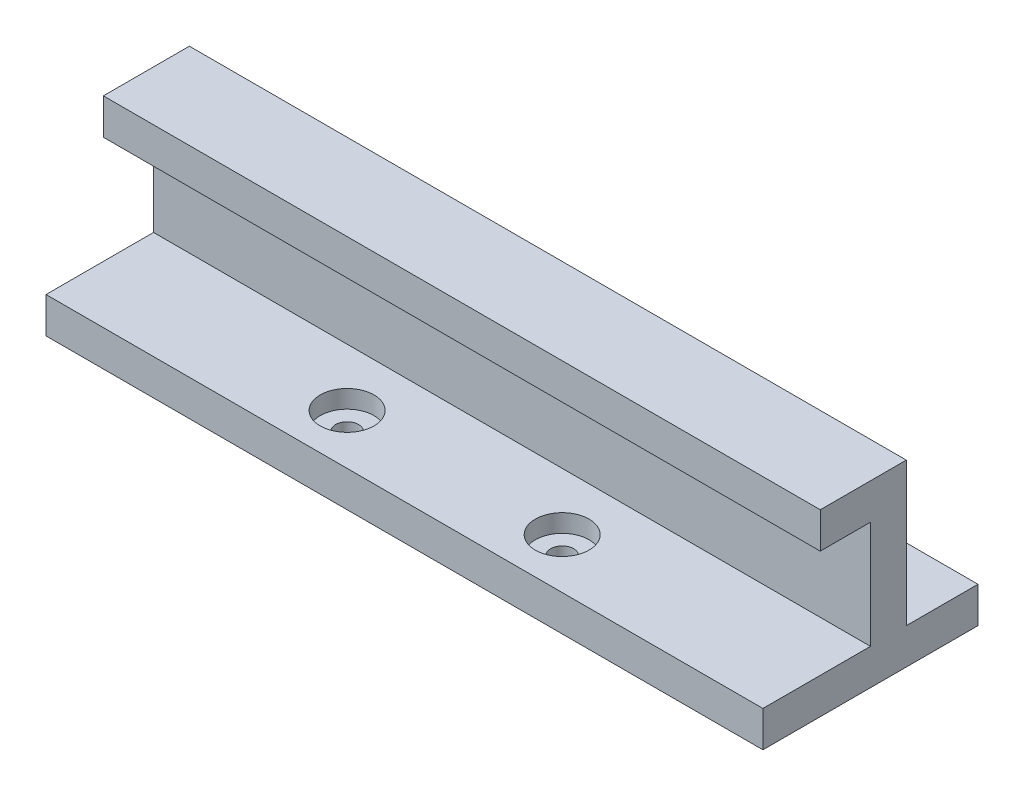
ISO-10303-21;
HEADER;
FILE_DESCRIPTION(('STEP AP214'),'2;1');
FILE_NAME('part.step','',(''),(''),'','','');
FILE_SCHEMA(('AUTOMOTIVE_DESIGN { 1 0 10303 214 1 1 1 1 }'));
ENDSEC;
DATA;
#1=APPLICATION_CONTEXT('core data for automotive mechanical design processes');
#2=APPLICATION_PROTOCOL_DEFINITION('international standard','automotive_design',2000,#1);
#3=PRODUCT_CONTEXT('',#1,'mechanical');
#4=PRODUCT('Part','Part','',(#3));
#5=PRODUCT_RELATED_PRODUCT_CATEGORY('part','',(#4));
#6=PRODUCT_DEFINITION_FORMATION('','',#4);
#7=PRODUCT_DEFINITION_CONTEXT('part definition',#1,'design');
#8=PRODUCT_DEFINITION('design','',#6,#7);
#9=PRODUCT_DEFINITION_SHAPE('','',#8);
#10=(LENGTH_UNIT() NAMED_UNIT(*) SI_UNIT(.MILLI.,.METRE.));
#11=(NAMED_UNIT(*) PLANE_ANGLE_UNIT() SI_UNIT($,.RADIAN.));
#12=(NAMED_UNIT(*) SI_UNIT($,.STERADIAN.) SOLID_ANGLE_UNIT());
#13=UNCERTAINTY_MEASURE_WITH_UNIT(LENGTH_MEASURE(1.E-05),#10,'distance_accuracy_value','');
#14=(GEOMETRIC_REPRESENTATION_CONTEXT(3) GLOBAL_UNCERTAINTY_ASSIGNED_CONTEXT((#13)) GLOBAL_UNIT_ASSIGNED_CONTEXT((#10,
#11,#12)) REPRESENTATION_CONTEXT('',''));
#15=CARTESIAN_POINT('',(0.,0.,0.));
#16=DIRECTION('',(0.,0.,1.));
#17=DIRECTION('',(1.,0.,0.));
#18=AXIS2_PLACEMENT_3D('',#15,#16,#17);
#19=CARTESIAN_POINT('',(35.,5.,-7.));
#20=DIRECTION('',(0.,-1.,0.));
#21=DIRECTION('',(0.,0.,-1.));
#22=AXIS2_PLACEMENT_3D('',#19,#20,#21);
#23=CYLINDRICAL_SURFACE('',#22,1.6);
#24=CARTESIAN_POINT('',(35.,0.,-7.));
#25=DIRECTION('',(0.,1.,0.));
#26=DIRECTION('',(0.,0.,1.));
#27=AXIS2_PLACEMENT_3D('',#24,#25,#26);
#28=CIRCLE('',#27,1.6);
#29=CARTESIAN_POINT('',(35.,0.,-5.4));
#30=VERTEX_POINT('',#29);
#31=EDGE_CURVE('E179',#30,#30,#28,.T.);
#32=ORIENTED_EDGE('',*,*,#31,.F.);
#33=EDGE_LOOP('',(#32));
#34=FACE_BOUND('',#33,.T.);
#35=CARTESIAN_POINT('',(35.,2.5,-7.));
#36=DIRECTION('',(0.,1.,0.));
#37=DIRECTION('',(0.,0.,1.));
#38=AXIS2_PLACEMENT_3D('',#35,#36,#37);
#39=CIRCLE('',#38,1.6);
#40=CARTESIAN_POINT('',(35.,2.5,-5.4));
#41=VERTEX_POINT('',#40);
#42=EDGE_CURVE('E37',#41,#41,#39,.T.);
#43=ORIENTED_EDGE('',*,*,#42,.T.);
#44=EDGE_LOOP('',(#43));
#45=FACE_BOUND('',#44,.T.);
#46=ADVANCED_FACE('F33',(#34,#45),#23,.F.);
#47=CARTESIAN_POINT('',(65.,5.,-7.));
#48=DIRECTION('',(0.,-1.,0.));
#49=DIRECTION('',(0.,0.,-1.));
#50=AXIS2_PLACEMENT_3D('',#47,#48,#49);
#51=CYLINDRICAL_SURFACE('',#50,1.60000000000001);
#52=CARTESIAN_POINT('',(65.,0.,-7.));
#53=DIRECTION('',(0.,1.,0.));
#54=DIRECTION('',(0.,0.,1.));
#55=AXIS2_PLACEMENT_3D('',#52,#53,#54);
#56=CIRCLE('',#55,1.60000000000001);
#57=CARTESIAN_POINT('',(65.,0.,-5.39999999999999));
#58=VERTEX_POINT('',#57);
#59=EDGE_CURVE('E176',#58,#58,#56,.T.);
#60=ORIENTED_EDGE('',*,*,#59,.F.);
#61=EDGE_LOOP('',(#60));
#62=FACE_BOUND('',#61,.T.);
#63=CARTESIAN_POINT('',(65.,2.5,-7.));
#64=DIRECTION('',(0.,1.,0.));
#65=DIRECTION('',(0.,0.,1.));
#66=AXIS2_PLACEMENT_3D('',#63,#64,#65);
#67=CIRCLE('',#66,1.60000000000001);
#68=CARTESIAN_POINT('',(65.,2.5,-5.39999999999999));
#69=VERTEX_POINT('',#68);
#70=EDGE_CURVE('E205',#69,#69,#67,.T.);
#71=ORIENTED_EDGE('',*,*,#70,.T.);
#72=EDGE_LOOP('',(#71));
#73=FACE_BOUND('',#72,.T.);
#74=ADVANCED_FACE('F269',(#62,#73),#51,.F.);
#75=CARTESIAN_POINT('',(70.,5.,-25.));
#76=DIRECTION('',(0.,-1.,0.));
#77=DIRECTION('',(0.,0.,-1.));
#78=AXIS2_PLACEMENT_3D('',#75,#76,#77);
#79=CYLINDRICAL_SURFACE('',#78,1.6);
#80=CARTESIAN_POINT('',(70.,0.,-25.));
#81=DIRECTION('',(0.,1.,0.));
#82=DIRECTION('',(0.,0.,1.));
#83=AXIS2_PLACEMENT_3D('',#80,#81,#82);
#84=CIRCLE('',#83,1.6);
#85=CARTESIAN_POINT('',(70.,0.,-23.4));
#86=VERTEX_POINT('',#85);
#87=EDGE_CURVE('E137',#86,#86,#84,.T.);
#88=ORIENTED_EDGE('',*,*,#87,.F.);
#89=EDGE_LOOP('',(#88));
#90=FACE_BOUND('',#89,.T.);
#91=CARTESIAN_POINT('',(70.,2.5,-25.));
#92=DIRECTION('',(0.,1.,0.));
#93=DIRECTION('',(0.,0.,1.));
#94=AXIS2_PLACEMENT_3D('',#91,#92,#93);
#95=CIRCLE('',#94,1.6);
#96=CARTESIAN_POINT('',(70.,2.5,-23.4));
#97=VERTEX_POINT('',#96);
#98=EDGE_CURVE('E202',#97,#97,#95,.T.);
#99=ORIENTED_EDGE('',*,*,#98,.T.);
#100=EDGE_LOOP('',(#99));
#101=FACE_BOUND('',#100,.T.);
#102=ADVANCED_FACE('F275',(#90,#101),#79,.F.);
#103=CARTESIAN_POINT('',(30.,5.,-25.));
#104=DIRECTION('',(0.,-1.,0.));
#105=DIRECTION('',(0.,0.,-1.));
#106=AXIS2_PLACEMENT_3D('',#103,#104,#105);
#107=CYLINDRICAL_SURFACE('',#106,1.6);
#108=CARTESIAN_POINT('',(30.,0.,-25.));
#109=DIRECTION('',(0.,1.,0.));
#110=DIRECTION('',(0.,0.,1.));
#111=AXIS2_PLACEMENT_3D('',#108,#109,#110);
#112=CIRCLE('',#111,1.6);
#113=CARTESIAN_POINT('',(30.,0.,-23.4));
#114=VERTEX_POINT('',#113);
#115=EDGE_CURVE('E210',#114,#114,#112,.T.);
#116=ORIENTED_EDGE('',*,*,#115,.F.);
#117=EDGE_LOOP('',(#116));
#118=FACE_BOUND('',#117,.T.);
#119=CARTESIAN_POINT('',(30.,2.5,-25.));
#120=DIRECTION('',(0.,1.,0.));
#121=DIRECTION('',(0.,0.,1.));
#122=AXIS2_PLACEMENT_3D('',#119,#120,#121);
#123=CIRCLE('',#122,1.6);
#124=CARTESIAN_POINT('',(30.,2.5,-23.4));
#125=VERTEX_POINT('',#124);
#126=EDGE_CURVE('E199',#125,#125,#123,.T.);
#127=ORIENTED_EDGE('',*,*,#126,.T.);
#128=EDGE_LOOP('',(#127));
#129=FACE_BOUND('',#128,.T.);
#130=ADVANCED_FACE('F292',(#118,#129),#107,.F.);
#131=CARTESIAN_POINT('',(0.,5.,-20.));
#132=DIRECTION('',(0.,0.,1.));
#133=DIRECTION('',(1.,0.,0.));
#134=AXIS2_PLACEMENT_3D('',#131,#132,#133);
#135=PLANE('',#134);
#136=DIRECTION('',(1.,0.,0.));
#137=VECTOR('',#136,1.);
#138=CARTESIAN_POINT('',(0.,5.,-20.));
#139=LINE('',#138,#137);
#140=CARTESIAN_POINT('',(0.,5.,-20.));
#141=VERTEX_POINT('',#140);
#142=CARTESIAN_POINT('',(100.,5.,-20.));
#143=VERTEX_POINT('',#142);
#144=EDGE_CURVE('E50',#141,#143,#139,.T.);
#145=ORIENTED_EDGE('',*,*,#144,.F.);
#146=DIRECTION('',(0.,-1.,0.));
#147=VECTOR('',#146,1.);
#148=CARTESIAN_POINT('',(0.,5.,-20.));
#149=LINE('',#148,#147);
#150=CARTESIAN_POINT('',(0.,25.,-20.));
#151=VERTEX_POINT('',#150);
#152=EDGE_CURVE('E119',#151,#141,#149,.T.);
#153=ORIENTED_EDGE('',*,*,#152,.F.);
#154=DIRECTION('',(-1.,0.,0.));
#155=VECTOR('',#154,1.);
#156=CARTESIAN_POINT('',(0.,25.,-20.));
#157=LINE('',#156,#155);
#158=CARTESIAN_POINT('',(100.,25.,-20.));
#159=VERTEX_POINT('',#158);
#160=EDGE_CURVE('E116',#159,#151,#157,.T.);
#161=ORIENTED_EDGE('',*,*,#160,.F.);
#162=DIRECTION('',(0.,-1.,0.));
#163=VECTOR('',#162,1.);
#164=CARTESIAN_POINT('',(100.,5.,-20.));
#165=LINE('',#164,#163);
#166=EDGE_CURVE('E112',#159,#143,#165,.T.);
#167=ORIENTED_EDGE('',*,*,#166,.T.);
#168=EDGE_LOOP('',(#145,#153,#161,#167));
#169=FACE_BOUND('',#168,.T.);
#170=ADVANCED_FACE('F114',(#169),#135,.F.);
#171=CARTESIAN_POINT('',(0.,25.,-15.));
#172=DIRECTION('',(0.,0.,-1.));
#173=DIRECTION('',(-1.,0.,0.));
#174=AXIS2_PLACEMENT_3D('',#171,#172,#173);
#175=PLANE('',#174);
#176=DIRECTION('',(1.,0.,0.));
#177=VECTOR('',#176,1.);
#178=CARTESIAN_POINT('',(0.,20.,-15.));
#179=LINE('',#178,#177);
#180=CARTESIAN_POINT('',(0.,20.,-15.));
#181=VERTEX_POINT('',#180);
#182=CARTESIAN_POINT('',(100.,20.,-15.));
#183=VERTEX_POINT('',#182);
#184=EDGE_CURVE('E148',#181,#183,#179,.T.);
#185=ORIENTED_EDGE('',*,*,#184,.F.);
#186=DIRECTION('',(0.,-1.,0.));
#187=VECTOR('',#186,1.);
#188=CARTESIAN_POINT('',(0.,25.,-15.));
#189=LINE('',#188,#187);
#190=CARTESIAN_POINT('',(0.,5.,-15.));
#191=VERTEX_POINT('',#190);
#192=EDGE_CURVE('E58',#181,#191,#189,.T.);
#193=ORIENTED_EDGE('',*,*,#192,.T.);
#194=DIRECTION('',(1.,0.,0.));
#195=VECTOR('',#194,1.);
#196=CARTESIAN_POINT('',(0.,5.,-15.));
#197=LINE('',#196,#195);
#198=CARTESIAN_POINT('',(100.,5.,-15.));
#199=VERTEX_POINT('',#198);
#200=EDGE_CURVE('E166',#191,#199,#197,.T.);
#201=ORIENTED_EDGE('',*,*,#200,.T.);
#202=DIRECTION('',(0.,-1.,0.));
#203=VECTOR('',#202,1.);
#204=CARTESIAN_POINT('',(100.,25.,-15.));
#205=LINE('',#204,#203);
#206=EDGE_CURVE('E172',#183,#199,#205,.T.);
#207=ORIENTED_EDGE('',*,*,#206,.F.);
#208=EDGE_LOOP('',(#185,#193,#201,#207));
#209=FACE_BOUND('',#208,.T.);
#210=ADVANCED_FACE('F285',(#209),#175,.F.);
#211=CARTESIAN_POINT('',(0.,5.,0.));
#212=DIRECTION('',(0.,-1.,0.));
#213=DIRECTION('',(0.,0.,-1.));
#214=AXIS2_PLACEMENT_3D('',#211,#212,#213);
#215=PLANE('',#214);
#216=CARTESIAN_POINT('',(65.,5.,-7.));
#217=DIRECTION('',(0.,1.,0.));
#218=DIRECTION('',(0.,0.,1.));
#219=AXIS2_PLACEMENT_3D('',#216,#217,#218);
#220=CIRCLE('',#219,3.75000000000001);
#221=CARTESIAN_POINT('',(65.,5.,-3.24999999999999));
#222=VERTEX_POINT('',#221);
#223=EDGE_CURVE('E231',#222,#222,#220,.T.);
#224=ORIENTED_EDGE('',*,*,#223,.F.);
#225=EDGE_LOOP('',(#224));
#226=FACE_BOUND('',#225,.T.);
#227=CARTESIAN_POINT('',(35.,5.,-7.));
#228=DIRECTION('',(0.,1.,0.));
#229=DIRECTION('',(0.,0.,1.));
#230=AXIS2_PLACEMENT_3D('',#227,#228,#229);
#231=CIRCLE('',#230,3.75);
#232=CARTESIAN_POINT('',(35.,5.,-3.25));
#233=VERTEX_POINT('',#232);
#234=EDGE_CURVE('E218',#233,#233,#231,.T.);
#235=ORIENTED_EDGE('',*,*,#234,.F.);
#236=EDGE_LOOP('',(#235));
#237=FACE_BOUND('',#236,.T.);
#238=ORIENTED_EDGE('',*,*,#200,.F.);
#239=DIRECTION('',(0.,0.,1.));
#240=VECTOR('',#239,1.);
#241=CARTESIAN_POINT('',(0.,5.,0.));
#242=LINE('',#241,#240);
#243=CARTESIAN_POINT('',(0.,5.,0.));
#244=VERTEX_POINT('',#243);
#245=EDGE_CURVE('E183',#191,#244,#242,.T.);
#246=ORIENTED_EDGE('',*,*,#245,.T.);
#247=DIRECTION('',(1.,0.,0.));
#248=VECTOR('',#247,1.);
#249=CARTESIAN_POINT('',(0.,5.,0.));
#250=LINE('',#249,#248);
#251=CARTESIAN_POINT('',(100.,5.,0.));
#252=VERTEX_POINT('',#251);
#253=EDGE_CURVE('E185',#244,#252,#250,.T.);
#254=ORIENTED_EDGE('',*,*,#253,.T.);
#255=DIRECTION('',(0.,0.,-1.));
#256=VECTOR('',#255,1.);
#257=CARTESIAN_POINT('',(100.,5.,0.));
#258=LINE('',#257,#256);
#259=EDGE_CURVE('E188',#252,#199,#258,.T.);
#260=ORIENTED_EDGE('',*,*,#259,.T.);
#261=EDGE_LOOP('',(#238,#246,#254,#260));
#262=FACE_BOUND('',#261,.T.);
#263=ADVANCED_FACE('F281',(#226,#237,#262),#215,.F.);
#264=CARTESIAN_POINT('',(0.,0.,0.));
#265=DIRECTION('',(0.,-1.,0.));
#266=DIRECTION('',(0.,0.,-1.));
#267=AXIS2_PLACEMENT_3D('',#264,#265,#266);
#268=PLANE('',#267);
#269=ORIENTED_EDGE('',*,*,#31,.T.);
#270=EDGE_LOOP('',(#269));
#271=FACE_BOUND('',#270,.T.);
#272=DIRECTION('',(0.,0.,1.));
#273=VECTOR('',#272,1.);
#274=CARTESIAN_POINT('',(0.,0.,0.));
#275=LINE('',#274,#273);
#276=CARTESIAN_POINT('',(0.,0.,-30.));
#277=VERTEX_POINT('',#276);
#278=CARTESIAN_POINT('',(0.,0.,0.));
#279=VERTEX_POINT('',#278);
#280=EDGE_CURVE('E182',#277,#279,#275,.T.);
#281=ORIENTED_EDGE('',*,*,#280,.F.);
#282=DIRECTION('',(-1.,0.,0.));
#283=VECTOR('',#282,1.);
#284=CARTESIAN_POINT('',(100.,0.,-30.));
#285=LINE('',#284,#283);
#286=CARTESIAN_POINT('',(100.,0.,-30.));
#287=VERTEX_POINT('',#286);
#288=EDGE_CURVE('E134',#287,#277,#285,.T.);
#289=ORIENTED_EDGE('',*,*,#288,.F.);
#290=DIRECTION('',(0.,0.,-1.));
#291=VECTOR('',#290,1.);
#292=CARTESIAN_POINT('',(100.,0.,0.));
#293=LINE('',#292,#291);
#294=CARTESIAN_POINT('',(100.,0.,0.));
#295=VERTEX_POINT('',#294);
#296=EDGE_CURVE('E186',#295,#287,#293,.T.);
#297=ORIENTED_EDGE('',*,*,#296,.F.);
#298=DIRECTION('',(1.,0.,0.));
#299=VECTOR('',#298,1.);
#300=CARTESIAN_POINT('',(0.,0.,0.));
#301=LINE('',#300,#299);
#302=EDGE_CURVE('E193',#279,#295,#301,.T.);
#303=ORIENTED_EDGE('',*,*,#302,.F.);
#304=EDGE_LOOP('',(#281,#289,#297,#303));
#305=FACE_BOUND('',#304,.T.);
#306=ORIENTED_EDGE('',*,*,#59,.T.);
#307=EDGE_LOOP('',(#306));
#308=FACE_BOUND('',#307,.T.);
#309=ORIENTED_EDGE('',*,*,#87,.T.);
#310=EDGE_LOOP('',(#309));
#311=FACE_BOUND('',#310,.T.);
#312=ORIENTED_EDGE('',*,*,#115,.T.);
#313=EDGE_LOOP('',(#312));
#314=FACE_BOUND('',#313,.T.);
#315=ADVANCED_FACE('F284',(#271,#305,#308,#311,#314),#268,.T.);
#316=CARTESIAN_POINT('',(0.,5.,0.));
#317=DIRECTION('',(1.,0.,0.));
#318=DIRECTION('',(0.,0.,-1.));
#319=AXIS2_PLACEMENT_3D('',#316,#317,#318);
#320=PLANE('',#319);
#321=ORIENTED_EDGE('',*,*,#280,.T.);
#322=DIRECTION('',(0.,-1.,0.));
#323=VECTOR('',#322,1.);
#324=CARTESIAN_POINT('',(0.,5.,0.));
#325=LINE('',#324,#323);
#326=EDGE_CURVE('E11',#244,#279,#325,.T.);
#327=ORIENTED_EDGE('',*,*,#326,.F.);
#328=ORIENTED_EDGE('',*,*,#245,.F.);
#329=ORIENTED_EDGE('',*,*,#192,.F.);
#330=DIRECTION('',(0.,0.,-1.));
#331=VECTOR('',#330,1.);
#332=CARTESIAN_POINT('',(0.,20.,-8.));
#333=LINE('',#332,#331);
#334=CARTESIAN_POINT('',(0.,20.,-8.));
#335=VERTEX_POINT('',#334);
#336=EDGE_CURVE('E164',#335,#181,#333,.T.);
#337=ORIENTED_EDGE('',*,*,#336,.F.);
#338=DIRECTION('',(0.,-1.,0.));
#339=VECTOR('',#338,1.);
#340=CARTESIAN_POINT('',(0.,25.,-8.));
#341=LINE('',#340,#339);
#342=CARTESIAN_POINT('',(0.,25.,-8.));
#343=VERTEX_POINT('',#342);
#344=EDGE_CURVE('E149',#343,#335,#341,.T.);
#345=ORIENTED_EDGE('',*,*,#344,.F.);
#346=DIRECTION('',(0.,0.,1.));
#347=VECTOR('',#346,1.);
#348=CARTESIAN_POINT('',(0.,25.,-20.));
#349=LINE('',#348,#347);
#350=EDGE_CURVE('E167',#151,#343,#349,.T.);
#351=ORIENTED_EDGE('',*,*,#350,.F.);
#352=ORIENTED_EDGE('',*,*,#152,.T.);
#353=DIRECTION('',(0.,0.,1.));
#354=VECTOR('',#353,1.);
#355=CARTESIAN_POINT('',(0.,5.,-30.));
#356=LINE('',#355,#354);
#357=CARTESIAN_POINT('',(0.,5.,-30.));
#358=VERTEX_POINT('',#357);
#359=EDGE_CURVE('E133',#358,#141,#356,.T.);
#360=ORIENTED_EDGE('',*,*,#359,.F.);
#361=DIRECTION('',(0.,-1.,0.));
#362=VECTOR('',#361,1.);
#363=CARTESIAN_POINT('',(0.,5.,-30.));
#364=LINE('',#363,#362);
#365=EDGE_CURVE('E143',#358,#277,#364,.T.);
#366=ORIENTED_EDGE('',*,*,#365,.T.);
#367=EDGE_LOOP('',(#321,#327,#328,#329,#337,#345,#351,#352,#360,#366));
#368=FACE_BOUND('',#367,.T.);
#369=ADVANCED_FACE('F35',(#368),#320,.F.);
#370=CARTESIAN_POINT('',(0.,5.,0.));
#371=DIRECTION('',(0.,0.,-1.));
#372=DIRECTION('',(-1.,0.,0.));
#373=AXIS2_PLACEMENT_3D('',#370,#371,#372);
#374=PLANE('',#373);
#375=ORIENTED_EDGE('',*,*,#302,.T.);
#376=DIRECTION('',(0.,-1.,0.));
#377=VECTOR('',#376,1.);
#378=CARTESIAN_POINT('',(100.,5.,0.));
#379=LINE('',#378,#377);
#380=EDGE_CURVE('E42',#252,#295,#379,.T.);
#381=ORIENTED_EDGE('',*,*,#380,.F.);
#382=ORIENTED_EDGE('',*,*,#253,.F.);
#383=ORIENTED_EDGE('',*,*,#326,.T.);
#384=EDGE_LOOP('',(#375,#381,#382,#383));
#385=FACE_BOUND('',#384,.T.);
#386=ADVANCED_FACE('F295',(#385),#374,.F.);
#387=CARTESIAN_POINT('',(100.,5.,0.));
#388=DIRECTION('',(-1.,0.,0.));
#389=DIRECTION('',(0.,0.,1.));
#390=AXIS2_PLACEMENT_3D('',#387,#388,#389);
#391=PLANE('',#390);
#392=ORIENTED_EDGE('',*,*,#296,.T.);
#393=DIRECTION('',(0.,-1.,0.));
#394=VECTOR('',#393,1.);
#395=CARTESIAN_POINT('',(100.,5.,-30.));
#396=LINE('',#395,#394);
#397=CARTESIAN_POINT('',(100.,5.,-30.));
#398=VERTEX_POINT('',#397);
#399=EDGE_CURVE('E125',#398,#287,#396,.T.);
#400=ORIENTED_EDGE('',*,*,#399,.F.);
#401=DIRECTION('',(0.,0.,-1.));
#402=VECTOR('',#401,1.);
#403=CARTESIAN_POINT('',(100.,5.,-20.));
#404=LINE('',#403,#402);
#405=EDGE_CURVE('E122',#143,#398,#404,.T.);
#406=ORIENTED_EDGE('',*,*,#405,.F.);
#407=ORIENTED_EDGE('',*,*,#166,.F.);
#408=DIRECTION('',(0.,0.,-1.));
#409=VECTOR('',#408,1.);
#410=CARTESIAN_POINT('',(100.,25.,-20.));
#411=LINE('',#410,#409);
#412=CARTESIAN_POINT('',(100.,25.,-8.));
#413=VERTEX_POINT('',#412);
#414=EDGE_CURVE('E169',#413,#159,#411,.T.);
#415=ORIENTED_EDGE('',*,*,#414,.F.);
#416=DIRECTION('',(0.,1.,0.));
#417=VECTOR('',#416,1.);
#418=CARTESIAN_POINT('',(100.,25.,-8.));
#419=LINE('',#418,#417);
#420=CARTESIAN_POINT('',(100.,20.,-8.));
#421=VERTEX_POINT('',#420);
#422=EDGE_CURVE('E154',#421,#413,#419,.T.);
#423=ORIENTED_EDGE('',*,*,#422,.F.);
#424=DIRECTION('',(0.,0.,-1.));
#425=VECTOR('',#424,1.);
#426=CARTESIAN_POINT('',(100.,20.,-8.));
#427=LINE('',#426,#425);
#428=EDGE_CURVE('E160',#421,#183,#427,.T.);
#429=ORIENTED_EDGE('',*,*,#428,.T.);
#430=ORIENTED_EDGE('',*,*,#206,.T.);
#431=ORIENTED_EDGE('',*,*,#259,.F.);
#432=ORIENTED_EDGE('',*,*,#380,.T.);
#433=EDGE_LOOP('',(#392,#400,#406,#407,#415,#423,#429,#430,#431,#432));
#434=FACE_BOUND('',#433,.T.);
#435=ADVANCED_FACE('F123',(#434),#391,.F.);
#436=CARTESIAN_POINT('',(0.,25.,0.));
#437=DIRECTION('',(0.,1.,0.));
#438=DIRECTION('',(0.,0.,1.));
#439=AXIS2_PLACEMENT_3D('',#436,#437,#438);
#440=PLANE('',#439);
#441=ORIENTED_EDGE('',*,*,#350,.T.);
#442=DIRECTION('',(-1.,0.,0.));
#443=VECTOR('',#442,1.);
#444=CARTESIAN_POINT('',(0.,25.,-8.));
#445=LINE('',#444,#443);
#446=EDGE_CURVE('E157',#413,#343,#445,.T.);
#447=ORIENTED_EDGE('',*,*,#446,.F.);
#448=ORIENTED_EDGE('',*,*,#414,.T.);
#449=ORIENTED_EDGE('',*,*,#160,.T.);
#450=EDGE_LOOP('',(#441,#447,#448,#449));
#451=FACE_BOUND('',#450,.T.);
#452=ADVANCED_FACE('F294',(#451),#440,.T.);
#453=CARTESIAN_POINT('',(0.,20.,-8.));
#454=DIRECTION('',(0.,1.,0.));
#455=DIRECTION('',(0.,0.,1.));
#456=AXIS2_PLACEMENT_3D('',#453,#454,#455);
#457=PLANE('',#456);
#458=ORIENTED_EDGE('',*,*,#184,.T.);
#459=ORIENTED_EDGE('',*,*,#428,.F.);
#460=DIRECTION('',(1.,0.,0.));
#461=VECTOR('',#460,1.);
#462=CARTESIAN_POINT('',(0.,20.,-8.));
#463=LINE('',#462,#461);
#464=EDGE_CURVE('E152',#335,#421,#463,.T.);
#465=ORIENTED_EDGE('',*,*,#464,.F.);
#466=ORIENTED_EDGE('',*,*,#336,.T.);
#467=EDGE_LOOP('',(#458,#459,#465,#466));
#468=FACE_BOUND('',#467,.T.);
#469=ADVANCED_FACE('F263',(#468),#457,.F.);
#470=CARTESIAN_POINT('',(0.,0.,-8.));
#471=DIRECTION('',(0.,0.,1.));
#472=DIRECTION('',(1.,0.,0.));
#473=AXIS2_PLACEMENT_3D('',#470,#471,#472);
#474=PLANE('',#473);
#475=ORIENTED_EDGE('',*,*,#344,.T.);
#476=ORIENTED_EDGE('',*,*,#464,.T.);
#477=ORIENTED_EDGE('',*,*,#422,.T.);
#478=ORIENTED_EDGE('',*,*,#446,.T.);
#479=EDGE_LOOP('',(#475,#476,#477,#478));
#480=FACE_BOUND('',#479,.T.);
#481=ADVANCED_FACE('F253',(#480),#474,.T.);
#482=CARTESIAN_POINT('',(0.,5.,0.));
#483=DIRECTION('',(0.,1.,0.));
#484=DIRECTION('',(0.,0.,1.));
#485=AXIS2_PLACEMENT_3D('',#482,#483,#484);
#486=PLANE('',#485);
#487=CARTESIAN_POINT('',(30.,5.,-25.));
#488=DIRECTION('',(0.,1.,0.));
#489=DIRECTION('',(0.,0.,1.));
#490=AXIS2_PLACEMENT_3D('',#487,#488,#489);
#491=CIRCLE('',#490,3.75);
#492=CARTESIAN_POINT('',(30.,5.,-21.25));
#493=VERTEX_POINT('',#492);
#494=EDGE_CURVE('E224',#493,#493,#491,.T.);
#495=ORIENTED_EDGE('',*,*,#494,.F.);
#496=EDGE_LOOP('',(#495));
#497=FACE_BOUND('',#496,.T.);
#498=CARTESIAN_POINT('',(70.,5.,-25.));
#499=DIRECTION('',(0.,1.,0.));
#500=DIRECTION('',(0.,0.,1.));
#501=AXIS2_PLACEMENT_3D('',#498,#499,#500);
#502=CIRCLE('',#501,3.75000000000001);
#503=CARTESIAN_POINT('',(70.,5.,-21.25));
#504=VERTEX_POINT('',#503);
#505=EDGE_CURVE('E236',#504,#504,#502,.T.);
#506=ORIENTED_EDGE('',*,*,#505,.F.);
#507=EDGE_LOOP('',(#506));
#508=FACE_BOUND('',#507,.T.);
#509=ORIENTED_EDGE('',*,*,#144,.T.);
#510=ORIENTED_EDGE('',*,*,#405,.T.);
#511=DIRECTION('',(-1.,0.,0.));
#512=VECTOR('',#511,1.);
#513=CARTESIAN_POINT('',(100.,5.,-30.));
#514=LINE('',#513,#512);
#515=EDGE_CURVE('E128',#398,#358,#514,.T.);
#516=ORIENTED_EDGE('',*,*,#515,.T.);
#517=ORIENTED_EDGE('',*,*,#359,.T.);
#518=EDGE_LOOP('',(#509,#510,#516,#517));
#519=FACE_BOUND('',#518,.T.);
#520=ADVANCED_FACE('F131',(#497,#508,#519),#486,.T.);
#521=CARTESIAN_POINT('',(100.,5.,-30.));
#522=DIRECTION('',(0.,0.,1.));
#523=DIRECTION('',(1.,0.,0.));
#524=AXIS2_PLACEMENT_3D('',#521,#522,#523);
#525=PLANE('',#524);
#526=ORIENTED_EDGE('',*,*,#288,.T.);
#527=ORIENTED_EDGE('',*,*,#365,.F.);
#528=ORIENTED_EDGE('',*,*,#515,.F.);
#529=ORIENTED_EDGE('',*,*,#399,.T.);
#530=EDGE_LOOP('',(#526,#527,#528,#529));
#531=FACE_BOUND('',#530,.T.);
#532=ADVANCED_FACE('F252',(#531),#525,.F.);
#533=CARTESIAN_POINT('',(30.,2.5,-25.));
#534=DIRECTION('',(0.,1.,0.));
#535=DIRECTION('',(0.,0.,1.));
#536=AXIS2_PLACEMENT_3D('',#533,#534,#535);
#537=CYLINDRICAL_SURFACE('',#536,3.75);
#538=CARTESIAN_POINT('',(30.,2.5,-25.));
#539=DIRECTION('',(0.,1.,0.));
#540=DIRECTION('',(0.,0.,1.));
#541=AXIS2_PLACEMENT_3D('',#538,#539,#540);
#542=CIRCLE('',#541,3.75);
#543=CARTESIAN_POINT('',(30.,2.5,-21.25));
#544=VERTEX_POINT('',#543);
#545=EDGE_CURVE('E227',#544,#544,#542,.T.);
#546=ORIENTED_EDGE('',*,*,#545,.F.);
#547=EDGE_LOOP('',(#546));
#548=FACE_BOUND('',#547,.T.);
#549=ORIENTED_EDGE('',*,*,#494,.T.);
#550=EDGE_LOOP('',(#549));
#551=FACE_BOUND('',#550,.T.);
#552=ADVANCED_FACE('F260',(#548,#551),#537,.F.);
#553=CARTESIAN_POINT('',(30.,2.5,-25.));
#554=DIRECTION('',(0.,1.,0.));
#555=DIRECTION('',(0.,0.,1.));
#556=AXIS2_PLACEMENT_3D('',#553,#554,#555);
#557=PLANE('',#556);
#558=ORIENTED_EDGE('',*,*,#126,.F.);
#559=EDGE_LOOP('',(#558));
#560=FACE_BOUND('',#559,.T.);
#561=ORIENTED_EDGE('',*,*,#545,.T.);
#562=EDGE_LOOP('',(#561));
#563=FACE_BOUND('',#562,.T.);
#564=ADVANCED_FACE('F247',(#560,#563),#557,.T.);
#565=CARTESIAN_POINT('',(70.,2.5,-25.));
#566=DIRECTION('',(0.,1.,0.));
#567=DIRECTION('',(0.,0.,1.));
#568=AXIS2_PLACEMENT_3D('',#565,#566,#567);
#569=CYLINDRICAL_SURFACE('',#568,3.75000000000001);
#570=CARTESIAN_POINT('',(70.,2.5,-25.));
#571=DIRECTION('',(0.,1.,0.));
#572=DIRECTION('',(0.,0.,1.));
#573=AXIS2_PLACEMENT_3D('',#570,#571,#572);
#574=CIRCLE('',#573,3.75000000000001);
#575=CARTESIAN_POINT('',(70.,2.5,-21.25));
#576=VERTEX_POINT('',#575);
#577=EDGE_CURVE('E228',#576,#576,#574,.T.);
#578=ORIENTED_EDGE('',*,*,#577,.F.);
#579=EDGE_LOOP('',(#578));
#580=FACE_BOUND('',#579,.T.);
#581=ORIENTED_EDGE('',*,*,#505,.T.);
#582=EDGE_LOOP('',(#581));
#583=FACE_BOUND('',#582,.T.);
#584=ADVANCED_FACE('F244',(#580,#583),#569,.F.);
#585=CARTESIAN_POINT('',(70.,2.5,-25.));
#586=DIRECTION('',(0.,1.,0.));
#587=DIRECTION('',(0.,0.,1.));
#588=AXIS2_PLACEMENT_3D('',#585,#586,#587);
#589=PLANE('',#588);
#590=ORIENTED_EDGE('',*,*,#98,.F.);
#591=EDGE_LOOP('',(#590));
#592=FACE_BOUND('',#591,.T.);
#593=ORIENTED_EDGE('',*,*,#577,.T.);
#594=EDGE_LOOP('',(#593));
#595=FACE_BOUND('',#594,.T.);
#596=ADVANCED_FACE('F242',(#592,#595),#589,.T.);
#597=CARTESIAN_POINT('',(65.,2.5,-7.));
#598=DIRECTION('',(0.,1.,0.));
#599=DIRECTION('',(0.,0.,1.));
#600=AXIS2_PLACEMENT_3D('',#597,#598,#599);
#601=CYLINDRICAL_SURFACE('',#600,3.75000000000001);
#602=CARTESIAN_POINT('',(65.,2.5,-7.));
#603=DIRECTION('',(0.,1.,0.));
#604=DIRECTION('',(0.,0.,1.));
#605=AXIS2_PLACEMENT_3D('',#602,#603,#604);
#606=CIRCLE('',#605,3.75000000000001);
#607=CARTESIAN_POINT('',(65.,2.5,-3.24999999999999));
#608=VERTEX_POINT('',#607);
#609=EDGE_CURVE('E221',#608,#608,#606,.T.);
#610=ORIENTED_EDGE('',*,*,#609,.F.);
#611=EDGE_LOOP('',(#610));
#612=FACE_BOUND('',#611,.T.);
#613=ORIENTED_EDGE('',*,*,#223,.T.);
#614=EDGE_LOOP('',(#613));
#615=FACE_BOUND('',#614,.T.);
#616=ADVANCED_FACE('F443',(#612,#615),#601,.F.);
#617=CARTESIAN_POINT('',(65.,2.5,-7.));
#618=DIRECTION('',(0.,1.,0.));
#619=DIRECTION('',(0.,0.,1.));
#620=AXIS2_PLACEMENT_3D('',#617,#618,#619);
#621=PLANE('',#620);
#622=ORIENTED_EDGE('',*,*,#70,.F.);
#623=EDGE_LOOP('',(#622));
#624=FACE_BOUND('',#623,.T.);
#625=ORIENTED_EDGE('',*,*,#609,.T.);
#626=EDGE_LOOP('',(#625));
#627=FACE_BOUND('',#626,.T.);
#628=ADVANCED_FACE('F453',(#624,#627),#621,.T.);
#629=CARTESIAN_POINT('',(35.,2.5,-7.));
#630=DIRECTION('',(0.,1.,0.));
#631=DIRECTION('',(0.,0.,1.));
#632=AXIS2_PLACEMENT_3D('',#629,#630,#631);
#633=CYLINDRICAL_SURFACE('',#632,3.75);
#634=CARTESIAN_POINT('',(35.,2.5,-7.));
#635=DIRECTION('',(0.,1.,0.));
#636=DIRECTION('',(0.,0.,1.));
#637=AXIS2_PLACEMENT_3D('',#634,#635,#636);
#638=CIRCLE('',#637,3.75);
#639=CARTESIAN_POINT('',(35.,2.5,-3.25));
#640=VERTEX_POINT('',#639);
#641=EDGE_CURVE('E203',#640,#640,#638,.T.);
#642=ORIENTED_EDGE('',*,*,#641,.F.);
#643=EDGE_LOOP('',(#642));
#644=FACE_BOUND('',#643,.T.);
#645=ORIENTED_EDGE('',*,*,#234,.T.);
#646=EDGE_LOOP('',(#645));
#647=FACE_BOUND('',#646,.T.);
#648=ADVANCED_FACE('F463',(#644,#647),#633,.F.);
#649=CARTESIAN_POINT('',(35.,2.5,-7.));
#650=DIRECTION('',(0.,1.,0.));
#651=DIRECTION('',(0.,0.,1.));
#652=AXIS2_PLACEMENT_3D('',#649,#650,#651);
#653=PLANE('',#652);
#654=ORIENTED_EDGE('',*,*,#42,.F.);
#655=EDGE_LOOP('',(#654));
#656=FACE_BOUND('',#655,.T.);
#657=ORIENTED_EDGE('',*,*,#641,.T.);
#658=EDGE_LOOP('',(#657));
#659=FACE_BOUND('',#658,.T.);
#660=ADVANCED_FACE('F473',(#656,#659),#653,.T.);
#661=CLOSED_SHELL('',(#46,#74,#102,#130,#170,#210,#263,#315,#369,#386,#435,#452,#469,#481,#520,
#532,#552,#564,#584,#596,#616,#628,#648,#660));
#662=MANIFOLD_SOLID_BREP('B2',#661);
#663=ADVANCED_BREP_SHAPE_REPRESENTATION('',(#18,#662),#14);
#664=SHAPE_DEFINITION_REPRESENTATION(#9,#663);
ENDSEC;
END-ISO-10303-21;
